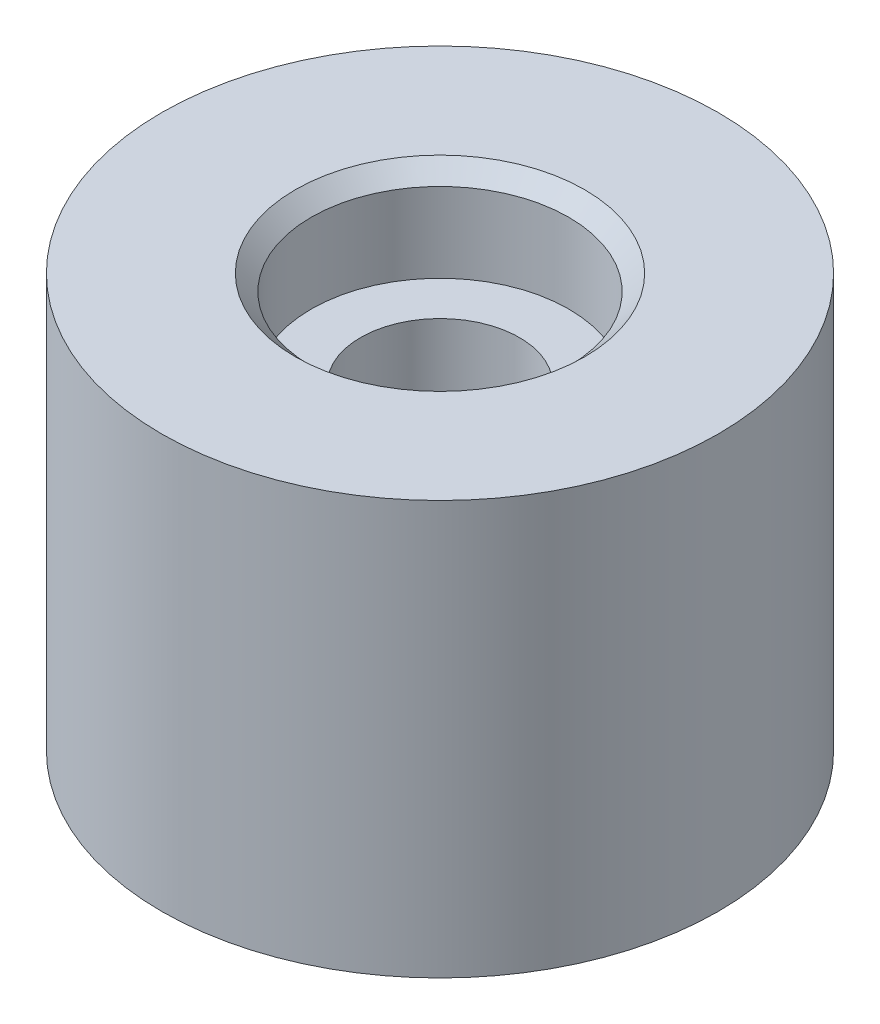
ISO-10303-21;
HEADER;
FILE_DESCRIPTION(('STEP AP214'),'2;1');
FILE_NAME('part.step','',(''),(''),'','','');
FILE_SCHEMA(('AUTOMOTIVE_DESIGN { 1 0 10303 214 1 1 1 1 }'));
ENDSEC;
DATA;
#1=APPLICATION_CONTEXT('core data for automotive mechanical design processes');
#2=APPLICATION_PROTOCOL_DEFINITION('international standard','automotive_design',2000,#1);
#3=PRODUCT_CONTEXT('',#1,'mechanical');
#4=PRODUCT('Part','Part','',(#3));
#5=PRODUCT_RELATED_PRODUCT_CATEGORY('part','',(#4));
#6=PRODUCT_DEFINITION_FORMATION('','',#4);
#7=PRODUCT_DEFINITION_CONTEXT('part definition',#1,'design');
#8=PRODUCT_DEFINITION('design','',#6,#7);
#9=PRODUCT_DEFINITION_SHAPE('','',#8);
#10=(LENGTH_UNIT() NAMED_UNIT(*) SI_UNIT(.MILLI.,.METRE.));
#11=(NAMED_UNIT(*) PLANE_ANGLE_UNIT() SI_UNIT($,.RADIAN.));
#12=(NAMED_UNIT(*) SI_UNIT($,.STERADIAN.) SOLID_ANGLE_UNIT());
#13=UNCERTAINTY_MEASURE_WITH_UNIT(LENGTH_MEASURE(1.E-05),#10,'distance_accuracy_value','');
#14=(GEOMETRIC_REPRESENTATION_CONTEXT(3) GLOBAL_UNCERTAINTY_ASSIGNED_CONTEXT((#13)) GLOBAL_UNIT_ASSIGNED_CONTEXT((#10,
#11,#12)) REPRESENTATION_CONTEXT('',''));
#15=CARTESIAN_POINT('',(0.,0.,0.));
#16=DIRECTION('',(0.,0.,1.));
#17=DIRECTION('',(1.,0.,0.));
#18=AXIS2_PLACEMENT_3D('',#15,#16,#17);
#19=CARTESIAN_POINT('',(0.,-0.000999999999999265,0.));
#20=DIRECTION('',(0.,1.,0.));
#21=DIRECTION('',(0.,0.,1.));
#22=AXIS2_PLACEMENT_3D('',#19,#20,#21);
#23=CYLINDRICAL_SURFACE('',#22,2.5);
#24=CARTESIAN_POINT('',(0.,10.,0.));
#25=DIRECTION('',(0.,1.,0.));
#26=DIRECTION('',(0.,0.,1.));
#27=AXIS2_PLACEMENT_3D('',#24,#25,#26);
#28=CIRCLE('',#27,2.5);
#29=CARTESIAN_POINT('',(0.,10.,2.5));
#30=VERTEX_POINT('',#29);
#31=EDGE_CURVE('E57',#30,#30,#28,.F.);
#32=ORIENTED_EDGE('',*,*,#31,.F.);
#33=EDGE_LOOP('',(#32));
#34=FACE_BOUND('',#33,.T.);
#35=CARTESIAN_POINT('',(0.,3.,0.));
#36=DIRECTION('',(0.,-1.,0.));
#37=DIRECTION('',(0.,0.,-1.));
#38=AXIS2_PLACEMENT_3D('',#35,#36,#37);
#39=CIRCLE('',#38,2.5);
#40=CARTESIAN_POINT('',(0.,3.,-2.5));
#41=VERTEX_POINT('',#40);
#42=EDGE_CURVE('E52',#41,#41,#39,.F.);
#43=ORIENTED_EDGE('',*,*,#42,.F.);
#44=EDGE_LOOP('',(#43));
#45=FACE_BOUND('',#44,.T.);
#46=ADVANCED_FACE('F31',(#34,#45),#23,.F.);
#47=CARTESIAN_POINT('',(0.,13.,0.));
#48=DIRECTION('',(0.,-1.,0.));
#49=DIRECTION('',(0.,0.,-1.));
#50=AXIS2_PLACEMENT_3D('',#47,#48,#49);
#51=CYLINDRICAL_SURFACE('',#50,8.75);
#52=CARTESIAN_POINT('',(0.,13.,0.));
#53=DIRECTION('',(0.,1.,0.));
#54=DIRECTION('',(0.,0.,1.));
#55=AXIS2_PLACEMENT_3D('',#52,#53,#54);
#56=CIRCLE('',#55,8.75);
#57=CARTESIAN_POINT('',(0.,13.,-8.75));
#58=VERTEX_POINT('',#57);
#59=EDGE_CURVE('E51',#58,#58,#56,.T.);
#60=CARTESIAN_POINT('',(0.,0.,0.));
#61=DIRECTION('',(0.,1.,0.));
#62=DIRECTION('',(0.,0.,1.));
#63=AXIS2_PLACEMENT_3D('',#60,#61,#62);
#64=CIRCLE('',#63,8.75);
#65=CARTESIAN_POINT('',(0.,0.,-8.75));
#66=VERTEX_POINT('',#65);
#67=EDGE_CURVE('E60',#66,#66,#64,.T.);
#68=CARTESIAN_POINT('',(0.,13.,-8.75));
#69=CARTESIAN_POINT('',(0.,12.8645833333333,-8.75));
#70=CARTESIAN_POINT('',(0.,12.7291666666667,-8.75));
#71=CARTESIAN_POINT('',(0.,12.4583333333333,-8.75));
#72=CARTESIAN_POINT('',(0.,12.3229166666667,-8.75));
#73=CARTESIAN_POINT('',(0.,12.0520833333333,-8.75));
#74=CARTESIAN_POINT('',(0.,11.9166666666667,-8.75));
#75=CARTESIAN_POINT('',(0.,11.6458333333333,-8.75));
#76=CARTESIAN_POINT('',(0.,11.5104166666667,-8.75));
#77=CARTESIAN_POINT('',(0.,11.2395833333333,-8.75));
#78=CARTESIAN_POINT('',(0.,11.1041666666667,-8.75));
#79=CARTESIAN_POINT('',(0.,10.8333333333333,-8.75));
#80=CARTESIAN_POINT('',(0.,10.6979166666667,-8.75));
#81=CARTESIAN_POINT('',(0.,10.4270833333333,-8.75));
#82=CARTESIAN_POINT('',(0.,10.2916666666667,-8.75));
#83=CARTESIAN_POINT('',(0.,10.0208333333333,-8.75));
#84=CARTESIAN_POINT('',(0.,9.88541666666667,-8.75));
#85=CARTESIAN_POINT('',(0.,9.61458333333333,-8.75));
#86=CARTESIAN_POINT('',(0.,9.47916666666667,-8.75));
#87=CARTESIAN_POINT('',(0.,9.20833333333333,-8.75));
#88=CARTESIAN_POINT('',(0.,9.07291666666666,-8.75));
#89=CARTESIAN_POINT('',(0.,8.80208333333333,-8.75));
#90=CARTESIAN_POINT('',(0.,8.66666666666667,-8.75));
#91=CARTESIAN_POINT('',(0.,8.39583333333333,-8.75));
#92=CARTESIAN_POINT('',(0.,8.26041666666667,-8.75));
#93=CARTESIAN_POINT('',(0.,7.98958333333333,-8.75));
#94=CARTESIAN_POINT('',(0.,7.85416666666667,-8.75));
#95=CARTESIAN_POINT('',(0.,7.58333333333333,-8.75));
#96=CARTESIAN_POINT('',(0.,7.44791666666667,-8.75));
#97=CARTESIAN_POINT('',(0.,7.17708333333333,-8.75));
#98=CARTESIAN_POINT('',(0.,7.04166666666667,-8.75));
#99=CARTESIAN_POINT('',(0.,6.77083333333333,-8.75));
#100=CARTESIAN_POINT('',(0.,6.63541666666667,-8.75));
#101=CARTESIAN_POINT('',(0.,6.36458333333333,-8.75));
#102=CARTESIAN_POINT('',(0.,6.22916666666667,-8.75));
#103=CARTESIAN_POINT('',(0.,5.95833333333333,-8.75));
#104=CARTESIAN_POINT('',(0.,5.82291666666667,-8.75));
#105=CARTESIAN_POINT('',(0.,5.55208333333333,-8.75));
#106=CARTESIAN_POINT('',(0.,5.41666666666667,-8.75));
#107=CARTESIAN_POINT('',(0.,5.14583333333333,-8.75));
#108=CARTESIAN_POINT('',(0.,5.01041666666667,-8.75));
#109=CARTESIAN_POINT('',(0.,4.73958333333333,-8.75));
#110=CARTESIAN_POINT('',(0.,4.60416666666667,-8.75));
#111=CARTESIAN_POINT('',(0.,4.33333333333333,-8.75));
#112=CARTESIAN_POINT('',(0.,4.19791666666667,-8.75));
#113=CARTESIAN_POINT('',(0.,3.92708333333333,-8.75));
#114=CARTESIAN_POINT('',(0.,3.79166666666667,-8.75));
#115=CARTESIAN_POINT('',(0.,3.52083333333333,-8.75));
#116=CARTESIAN_POINT('',(0.,3.38541666666667,-8.75));
#117=CARTESIAN_POINT('',(0.,3.11458333333333,-8.75));
#118=CARTESIAN_POINT('',(0.,2.97916666666667,-8.75));
#119=CARTESIAN_POINT('',(0.,2.70833333333333,-8.75));
#120=CARTESIAN_POINT('',(0.,2.57291666666667,-8.75));
#121=CARTESIAN_POINT('',(0.,2.30208333333333,-8.75));
#122=CARTESIAN_POINT('',(0.,2.16666666666667,-8.75));
#123=CARTESIAN_POINT('',(0.,1.89583333333333,-8.75));
#124=CARTESIAN_POINT('',(0.,1.76041666666667,-8.75));
#125=CARTESIAN_POINT('',(0.,1.48958333333333,-8.75));
#126=CARTESIAN_POINT('',(0.,1.35416666666667,-8.75));
#127=CARTESIAN_POINT('',(0.,1.08333333333333,-8.75));
#128=CARTESIAN_POINT('',(0.,0.947916666666667,-8.75));
#129=CARTESIAN_POINT('',(0.,0.677083333333334,-8.75));
#130=CARTESIAN_POINT('',(0.,0.541666666666667,-8.75));
#131=CARTESIAN_POINT('',(0.,0.270833333333334,-8.75));
#132=CARTESIAN_POINT('',(0.,0.135416666666667,-8.75));
#133=CARTESIAN_POINT('',(0.,0.,-8.75));
#134=B_SPLINE_CURVE_WITH_KNOTS('',3,(#68,#69,#70,#71,#72,#73,#74,#75,#76,#77,#78,#79,#80,#81,
#82,#83,#84,#85,#86,#87,#88,#89,#90,#91,#92,#93,#94,#95,#96,#97,#98,#99,#100,#101,#102,#103,
#104,#105,#106,#107,#108,#109,#110,#111,#112,#113,#114,#115,#116,#117,#118,#119,#120,#121,#122,
#123,#124,#125,#126,#127,#128,#129,#130,#131,#132,#133),.UNSPECIFIED.,.F.,.F.,(4,2,2,2,2,2,2,2,
2,2,2,2,2,2,2,2,2,2,2,2,2,2,2,2,2,2,2,2,2,2,2,2,4),(0.,0.40625,0.812500000000001,1.21875,1.625,
2.03125,2.4375,2.84375,3.25,3.65625,4.0625,4.46875,4.875,5.28125,5.6875,6.09375,6.5,6.90625,
7.3125,7.71875,8.125,8.53125,8.9375,9.34375,9.75,10.15625,10.5625,10.96875,11.375,11.78125,
12.1875,12.59375,13.),.UNSPECIFIED.);
#135=EDGE_CURVE('BSEAM80',#58,#66,#134,.T.);
#136=ORIENTED_EDGE('',*,*,#59,.F.);
#137=ORIENTED_EDGE('',*,*,#67,.T.);
#138=ORIENTED_EDGE('',*,*,#135,.T.);
#139=ORIENTED_EDGE('',*,*,#135,.F.);
#140=EDGE_LOOP('',(#136,#138,#137,#139));
#141=FACE_BOUND('',#140,.T.);
#142=ADVANCED_FACE('F80',(#141),#51,.T.);
#143=CARTESIAN_POINT('',(0.,13.,0.));
#144=DIRECTION('',(0.,1.,0.));
#145=DIRECTION('',(0.,0.,1.));
#146=AXIS2_PLACEMENT_3D('',#143,#144,#145);
#147=PLANE('',#146);
#148=CARTESIAN_POINT('',(0.,13.,0.));
#149=DIRECTION('',(0.,1.,0.));
#150=DIRECTION('',(0.,0.,1.));
#151=AXIS2_PLACEMENT_3D('',#148,#149,#150);
#152=CIRCLE('',#151,4.54999999999999);
#153=CARTESIAN_POINT('',(0.,13.,4.54999999999999));
#154=VERTEX_POINT('',#153);
#155=EDGE_CURVE('E10',#154,#154,#152,.F.);
#156=ORIENTED_EDGE('',*,*,#155,.T.);
#157=EDGE_LOOP('',(#156));
#158=FACE_BOUND('',#157,.T.);
#159=ORIENTED_EDGE('',*,*,#59,.T.);
#160=EDGE_LOOP('',(#159));
#161=FACE_BOUND('',#160,.T.);
#162=ADVANCED_FACE('F86',(#158,#161),#147,.T.);
#163=CARTESIAN_POINT('',(0.,0.,0.));
#164=DIRECTION('',(0.,1.,0.));
#165=DIRECTION('',(0.,0.,1.));
#166=AXIS2_PLACEMENT_3D('',#163,#164,#165);
#167=PLANE('',#166);
#168=CARTESIAN_POINT('',(0.,0.,0.));
#169=DIRECTION('',(0.,1.,0.));
#170=DIRECTION('',(0.,0.,1.));
#171=AXIS2_PLACEMENT_3D('',#168,#169,#170);
#172=CIRCLE('',#171,4.55);
#173=CARTESIAN_POINT('',(0.,0.,4.55));
#174=VERTEX_POINT('',#173);
#175=EDGE_CURVE('E46',#174,#174,#172,.T.);
#176=ORIENTED_EDGE('',*,*,#175,.T.);
#177=EDGE_LOOP('',(#176));
#178=FACE_BOUND('',#177,.T.);
#179=ORIENTED_EDGE('',*,*,#67,.F.);
#180=EDGE_LOOP('',(#179));
#181=FACE_BOUND('',#180,.T.);
#182=ADVANCED_FACE('F95',(#178,#181),#167,.F.);
#183=CARTESIAN_POINT('',(0.,10.,0.));
#184=DIRECTION('',(0.,1.,0.));
#185=DIRECTION('',(0.,0.,1.));
#186=AXIS2_PLACEMENT_3D('',#183,#184,#185);
#187=PLANE('',#186);
#188=CARTESIAN_POINT('',(0.,10.,0.));
#189=DIRECTION('',(0.,1.,0.));
#190=DIRECTION('',(0.,0.,1.));
#191=AXIS2_PLACEMENT_3D('',#188,#189,#190);
#192=CIRCLE('',#191,4.05);
#193=CARTESIAN_POINT('',(0.,10.,4.05));
#194=VERTEX_POINT('',#193);
#195=EDGE_CURVE('E55',#194,#194,#192,.T.);
#196=ORIENTED_EDGE('',*,*,#195,.T.);
#197=EDGE_LOOP('',(#196));
#198=FACE_BOUND('',#197,.T.);
#199=ORIENTED_EDGE('',*,*,#31,.T.);
#200=EDGE_LOOP('',(#199));
#201=FACE_BOUND('',#200,.T.);
#202=ADVANCED_FACE('F97',(#198,#201),#187,.T.);
#203=CARTESIAN_POINT('',(0.,10.,0.));
#204=DIRECTION('',(0.,1.,0.));
#205=DIRECTION('',(0.,0.,1.));
#206=AXIS2_PLACEMENT_3D('',#203,#204,#205);
#207=CYLINDRICAL_SURFACE('',#206,4.05);
#208=CARTESIAN_POINT('',(0.,12.5,0.));
#209=DIRECTION('',(0.,1.,0.));
#210=DIRECTION('',(0.,0.,1.));
#211=AXIS2_PLACEMENT_3D('',#208,#209,#210);
#212=CIRCLE('',#211,4.05);
#213=CARTESIAN_POINT('',(0.,12.5,4.05));
#214=VERTEX_POINT('',#213);
#215=EDGE_CURVE('E38',#214,#214,#212,.T.);
#216=ORIENTED_EDGE('',*,*,#215,.T.);
#217=EDGE_LOOP('',(#216));
#218=FACE_BOUND('',#217,.T.);
#219=ORIENTED_EDGE('',*,*,#195,.F.);
#220=EDGE_LOOP('',(#219));
#221=FACE_BOUND('',#220,.T.);
#222=ADVANCED_FACE('F75',(#218,#221),#207,.F.);
#223=CARTESIAN_POINT('',(0.,3.,0.));
#224=DIRECTION('',(0.,-1.,0.));
#225=DIRECTION('',(0.,0.,1.));
#226=AXIS2_PLACEMENT_3D('',#223,#224,#225);
#227=PLANE('',#226);
#228=CARTESIAN_POINT('',(0.,3.,0.));
#229=DIRECTION('',(0.,1.,0.));
#230=DIRECTION('',(0.,0.,1.));
#231=AXIS2_PLACEMENT_3D('',#228,#229,#230);
#232=CIRCLE('',#231,4.05);
#233=CARTESIAN_POINT('',(0.,3.,4.05));
#234=VERTEX_POINT('',#233);
#235=EDGE_CURVE('E56',#234,#234,#232,.T.);
#236=ORIENTED_EDGE('',*,*,#235,.F.);
#237=EDGE_LOOP('',(#236));
#238=FACE_BOUND('',#237,.T.);
#239=ORIENTED_EDGE('',*,*,#42,.T.);
#240=EDGE_LOOP('',(#239));
#241=FACE_BOUND('',#240,.T.);
#242=ADVANCED_FACE('F72',(#238,#241),#227,.T.);
#243=CARTESIAN_POINT('',(0.,3.,0.));
#244=DIRECTION('',(0.,-1.,0.));
#245=DIRECTION('',(0.,0.,-1.));
#246=AXIS2_PLACEMENT_3D('',#243,#244,#245);
#247=CYLINDRICAL_SURFACE('',#246,4.05);
#248=CARTESIAN_POINT('',(0.,0.500000000000002,0.));
#249=DIRECTION('',(0.,1.,0.));
#250=DIRECTION('',(0.,0.,1.));
#251=AXIS2_PLACEMENT_3D('',#248,#249,#250);
#252=CIRCLE('',#251,4.05);
#253=CARTESIAN_POINT('',(0.,0.500000000000002,4.05));
#254=VERTEX_POINT('',#253);
#255=EDGE_CURVE('E42',#254,#254,#252,.F.);
#256=ORIENTED_EDGE('',*,*,#255,.T.);
#257=EDGE_LOOP('',(#256));
#258=FACE_BOUND('',#257,.T.);
#259=ORIENTED_EDGE('',*,*,#235,.T.);
#260=EDGE_LOOP('',(#259));
#261=FACE_BOUND('',#260,.T.);
#262=ADVANCED_FACE('F70',(#258,#261),#247,.F.);
#263=CARTESIAN_POINT('',(0.,0.,0.));
#264=DIRECTION('',(0.,-1.,0.));
#265=DIRECTION('',(0.,0.,-1.));
#266=AXIS2_PLACEMENT_3D('',#263,#264,#265);
#267=CONICAL_SURFACE('',#266,4.55,0.785398163397445);
#268=ORIENTED_EDGE('',*,*,#255,.F.);
#269=EDGE_LOOP('',(#268));
#270=FACE_BOUND('',#269,.T.);
#271=ORIENTED_EDGE('',*,*,#175,.F.);
#272=EDGE_LOOP('',(#271));
#273=FACE_BOUND('',#272,.T.);
#274=ADVANCED_FACE('F99',(#270,#273),#267,.F.);
#275=CARTESIAN_POINT('',(0.,12.5,0.));
#276=DIRECTION('',(0.,1.,0.));
#277=DIRECTION('',(0.,0.,1.));
#278=AXIS2_PLACEMENT_3D('',#275,#276,#277);
#279=CONICAL_SURFACE('',#278,4.05,0.785398163397448);
#280=ORIENTED_EDGE('',*,*,#155,.F.);
#281=EDGE_LOOP('',(#280));
#282=FACE_BOUND('',#281,.T.);
#283=ORIENTED_EDGE('',*,*,#215,.F.);
#284=EDGE_LOOP('',(#283));
#285=FACE_BOUND('',#284,.T.);
#286=ADVANCED_FACE('F33',(#282,#285),#279,.F.);
#287=CLOSED_SHELL('',(#46,#142,#162,#182,#202,#222,#242,#262,#274,#286));
#288=MANIFOLD_SOLID_BREP('B2',#287);
#289=ADVANCED_BREP_SHAPE_REPRESENTATION('',(#18,#288),#14);
#290=SHAPE_DEFINITION_REPRESENTATION(#9,#289);
ENDSEC;
END-ISO-10303-21;
